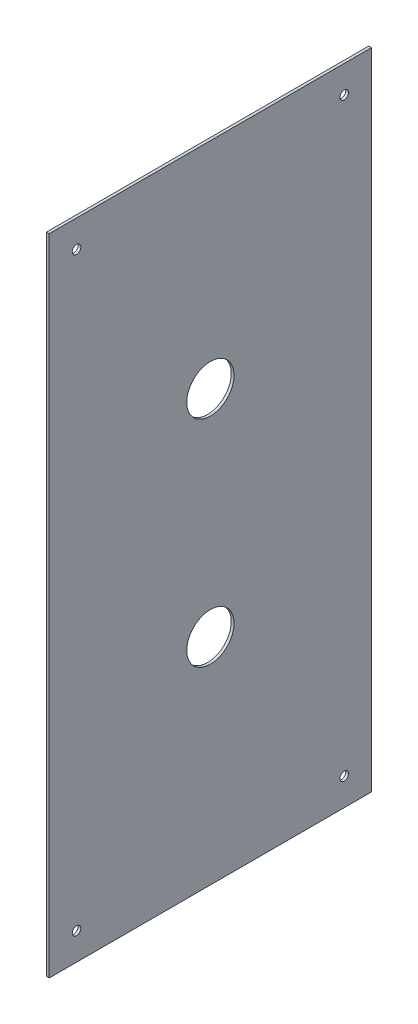
ISO-10303-21;
HEADER;
FILE_DESCRIPTION(('STEP AP214'),'2;1');
FILE_NAME('part.step','',(''),(''),'','','');
FILE_SCHEMA(('AUTOMOTIVE_DESIGN { 1 0 10303 214 1 1 1 1 }'));
ENDSEC;
DATA;
#1=APPLICATION_CONTEXT('core data for automotive mechanical design processes');
#2=APPLICATION_PROTOCOL_DEFINITION('international standard','automotive_design',2000,#1);
#3=PRODUCT_CONTEXT('',#1,'mechanical');
#4=PRODUCT('Part','Part','',(#3));
#5=PRODUCT_RELATED_PRODUCT_CATEGORY('part','',(#4));
#6=PRODUCT_DEFINITION_FORMATION('','',#4);
#7=PRODUCT_DEFINITION_CONTEXT('part definition',#1,'design');
#8=PRODUCT_DEFINITION('design','',#6,#7);
#9=PRODUCT_DEFINITION_SHAPE('','',#8);
#10=(LENGTH_UNIT() NAMED_UNIT(*) SI_UNIT(.MILLI.,.METRE.));
#11=(NAMED_UNIT(*) PLANE_ANGLE_UNIT() SI_UNIT($,.RADIAN.));
#12=(NAMED_UNIT(*) SI_UNIT($,.STERADIAN.) SOLID_ANGLE_UNIT());
#13=UNCERTAINTY_MEASURE_WITH_UNIT(LENGTH_MEASURE(1.E-05),#10,'distance_accuracy_value','');
#14=(GEOMETRIC_REPRESENTATION_CONTEXT(3) GLOBAL_UNCERTAINTY_ASSIGNED_CONTEXT((#13)) GLOBAL_UNIT_ASSIGNED_CONTEXT((#10,
#11,#12)) REPRESENTATION_CONTEXT('',''));
#15=CARTESIAN_POINT('',(0.,0.,0.));
#16=DIRECTION('',(0.,0.,1.));
#17=DIRECTION('',(1.,0.,0.));
#18=AXIS2_PLACEMENT_3D('',#15,#16,#17);
#19=CARTESIAN_POINT('',(1.3,150.,-75.));
#20=DIRECTION('',(0.,-1.,0.));
#21=DIRECTION('',(0.,0.,-1.));
#22=AXIS2_PLACEMENT_3D('',#19,#20,#21);
#23=PLANE('',#22);
#24=DIRECTION('',(0.,0.,1.));
#25=VECTOR('',#24,1.);
#26=CARTESIAN_POINT('',(0.,150.,-75.));
#27=LINE('',#26,#25);
#28=CARTESIAN_POINT('',(0.,150.,-75.));
#29=VERTEX_POINT('',#28);
#30=CARTESIAN_POINT('',(0.,150.,75.));
#31=VERTEX_POINT('',#30);
#32=EDGE_CURVE('E114',#29,#31,#27,.T.);
#33=ORIENTED_EDGE('',*,*,#32,.T.);
#34=DIRECTION('',(-1.,0.,0.));
#35=VECTOR('',#34,1.);
#36=CARTESIAN_POINT('',(1.3,150.,75.));
#37=LINE('',#36,#35);
#38=CARTESIAN_POINT('',(1.3,150.,75.));
#39=VERTEX_POINT('',#38);
#40=EDGE_CURVE('E11',#39,#31,#37,.T.);
#41=ORIENTED_EDGE('',*,*,#40,.F.);
#42=DIRECTION('',(0.,0.,1.));
#43=VECTOR('',#42,1.);
#44=CARTESIAN_POINT('',(1.3,150.,-75.));
#45=LINE('',#44,#43);
#46=CARTESIAN_POINT('',(1.3,150.,-75.));
#47=VERTEX_POINT('',#46);
#48=EDGE_CURVE('E100',#47,#39,#45,.T.);
#49=ORIENTED_EDGE('',*,*,#48,.F.);
#50=DIRECTION('',(-1.,0.,0.));
#51=VECTOR('',#50,1.);
#52=CARTESIAN_POINT('',(1.3,150.,-75.));
#53=LINE('',#52,#51);
#54=EDGE_CURVE('E108',#47,#29,#53,.T.);
#55=ORIENTED_EDGE('',*,*,#54,.T.);
#56=EDGE_LOOP('',(#33,#41,#49,#55));
#57=FACE_BOUND('',#56,.T.);
#58=ADVANCED_FACE('F44',(#57),#23,.F.);
#59=CARTESIAN_POINT('',(1.3,-150.,75.));
#60=DIRECTION('',(0.,0.,-1.));
#61=DIRECTION('',(-1.,0.,0.));
#62=AXIS2_PLACEMENT_3D('',#59,#60,#61);
#63=PLANE('',#62);
#64=DIRECTION('',(0.,-1.,0.));
#65=VECTOR('',#64,1.);
#66=CARTESIAN_POINT('',(0.,-150.,75.));
#67=LINE('',#66,#65);
#68=CARTESIAN_POINT('',(0.,-150.,75.));
#69=VERTEX_POINT('',#68);
#70=EDGE_CURVE('E105',#31,#69,#67,.T.);
#71=ORIENTED_EDGE('',*,*,#70,.T.);
#72=DIRECTION('',(-1.,0.,0.));
#73=VECTOR('',#72,1.);
#74=CARTESIAN_POINT('',(1.3,-150.,75.));
#75=LINE('',#74,#73);
#76=CARTESIAN_POINT('',(1.3,-150.,75.));
#77=VERTEX_POINT('',#76);
#78=EDGE_CURVE('E53',#77,#69,#75,.T.);
#79=ORIENTED_EDGE('',*,*,#78,.F.);
#80=DIRECTION('',(0.,-1.,0.));
#81=VECTOR('',#80,1.);
#82=CARTESIAN_POINT('',(1.3,-150.,75.));
#83=LINE('',#82,#81);
#84=EDGE_CURVE('E95',#39,#77,#83,.T.);
#85=ORIENTED_EDGE('',*,*,#84,.F.);
#86=ORIENTED_EDGE('',*,*,#40,.T.);
#87=EDGE_LOOP('',(#71,#79,#85,#86));
#88=FACE_BOUND('',#87,.T.);
#89=ADVANCED_FACE('F101',(#88),#63,.F.);
#90=CARTESIAN_POINT('',(1.3,-150.,-75.));
#91=DIRECTION('',(0.,1.,0.));
#92=DIRECTION('',(0.,0.,1.));
#93=AXIS2_PLACEMENT_3D('',#90,#91,#92);
#94=PLANE('',#93);
#95=DIRECTION('',(0.,0.,-1.));
#96=VECTOR('',#95,1.);
#97=CARTESIAN_POINT('',(0.,-150.,-75.));
#98=LINE('',#97,#96);
#99=CARTESIAN_POINT('',(0.,-150.,-75.));
#100=VERTEX_POINT('',#99);
#101=EDGE_CURVE('E76',#69,#100,#98,.T.);
#102=ORIENTED_EDGE('',*,*,#101,.T.);
#103=DIRECTION('',(-1.,0.,0.));
#104=VECTOR('',#103,1.);
#105=CARTESIAN_POINT('',(1.3,-150.,-75.));
#106=LINE('',#105,#104);
#107=CARTESIAN_POINT('',(1.3,-150.,-75.));
#108=VERTEX_POINT('',#107);
#109=EDGE_CURVE('E102',#108,#100,#106,.T.);
#110=ORIENTED_EDGE('',*,*,#109,.F.);
#111=DIRECTION('',(0.,0.,-1.));
#112=VECTOR('',#111,1.);
#113=CARTESIAN_POINT('',(1.3,-150.,-75.));
#114=LINE('',#113,#112);
#115=EDGE_CURVE('E92',#77,#108,#114,.T.);
#116=ORIENTED_EDGE('',*,*,#115,.F.);
#117=ORIENTED_EDGE('',*,*,#78,.T.);
#118=EDGE_LOOP('',(#102,#110,#116,#117));
#119=FACE_BOUND('',#118,.T.);
#120=ADVANCED_FACE('F104',(#119),#94,.F.);
#121=CARTESIAN_POINT('',(1.3,-150.,-75.));
#122=DIRECTION('',(0.,0.,1.));
#123=DIRECTION('',(1.,0.,0.));
#124=AXIS2_PLACEMENT_3D('',#121,#122,#123);
#125=PLANE('',#124);
#126=DIRECTION('',(0.,1.,0.));
#127=VECTOR('',#126,1.);
#128=CARTESIAN_POINT('',(0.,-150.,-75.));
#129=LINE('',#128,#127);
#130=EDGE_CURVE('E85',#100,#29,#129,.T.);
#131=ORIENTED_EDGE('',*,*,#130,.T.);
#132=ORIENTED_EDGE('',*,*,#54,.F.);
#133=DIRECTION('',(0.,1.,0.));
#134=VECTOR('',#133,1.);
#135=CARTESIAN_POINT('',(1.3,-150.,-75.));
#136=LINE('',#135,#134);
#137=EDGE_CURVE('E65',#108,#47,#136,.T.);
#138=ORIENTED_EDGE('',*,*,#137,.F.);
#139=ORIENTED_EDGE('',*,*,#109,.T.);
#140=EDGE_LOOP('',(#131,#132,#138,#139));
#141=FACE_BOUND('',#140,.T.);
#142=ADVANCED_FACE('F130',(#141),#125,.F.);
#143=CARTESIAN_POINT('',(1.3,0.,0.));
#144=DIRECTION('',(-1.,0.,0.));
#145=DIRECTION('',(0.,0.,1.));
#146=AXIS2_PLACEMENT_3D('',#143,#144,#145);
#147=PLANE('',#146);
#148=CARTESIAN_POINT('',(1.3,50.,0.));
#149=DIRECTION('',(1.,0.,0.));
#150=DIRECTION('',(0.,0.,-1.));
#151=AXIS2_PLACEMENT_3D('',#148,#149,#150);
#152=CIRCLE('',#151,11.);
#153=CARTESIAN_POINT('',(1.3,50.,-11.));
#154=VERTEX_POINT('',#153);
#155=EDGE_CURVE('E177',#154,#154,#152,.T.);
#156=ORIENTED_EDGE('',*,*,#155,.F.);
#157=EDGE_LOOP('',(#156));
#158=FACE_BOUND('',#157,.T.);
#159=CARTESIAN_POINT('',(1.3,-50.,0.));
#160=DIRECTION('',(1.,0.,0.));
#161=DIRECTION('',(0.,0.,-1.));
#162=AXIS2_PLACEMENT_3D('',#159,#160,#161);
#163=CIRCLE('',#162,11.);
#164=CARTESIAN_POINT('',(1.3,-50.,-11.));
#165=VERTEX_POINT('',#164);
#166=EDGE_CURVE('E166',#165,#165,#163,.T.);
#167=ORIENTED_EDGE('',*,*,#166,.F.);
#168=EDGE_LOOP('',(#167));
#169=FACE_BOUND('',#168,.T.);
#170=CARTESIAN_POINT('',(1.3,137.3,-62.3));
#171=DIRECTION('',(1.,0.,0.));
#172=DIRECTION('',(0.,0.,-1.));
#173=AXIS2_PLACEMENT_3D('',#170,#171,#172);
#174=CIRCLE('',#173,1.99999999999997);
#175=CARTESIAN_POINT('',(1.3,137.3,-64.3));
#176=VERTEX_POINT('',#175);
#177=EDGE_CURVE('E161',#176,#176,#174,.T.);
#178=ORIENTED_EDGE('',*,*,#177,.F.);
#179=EDGE_LOOP('',(#178));
#180=FACE_BOUND('',#179,.T.);
#181=CARTESIAN_POINT('',(1.3,137.3,62.3));
#182=DIRECTION('',(1.,0.,0.));
#183=DIRECTION('',(0.,0.,-1.));
#184=AXIS2_PLACEMENT_3D('',#181,#182,#183);
#185=CIRCLE('',#184,1.99999999999997);
#186=CARTESIAN_POINT('',(1.3,137.3,60.3));
#187=VERTEX_POINT('',#186);
#188=EDGE_CURVE('E153',#187,#187,#185,.T.);
#189=ORIENTED_EDGE('',*,*,#188,.F.);
#190=EDGE_LOOP('',(#189));
#191=FACE_BOUND('',#190,.T.);
#192=CARTESIAN_POINT('',(1.3,-137.3,-62.3));
#193=DIRECTION('',(1.,0.,0.));
#194=DIRECTION('',(0.,0.,-1.));
#195=AXIS2_PLACEMENT_3D('',#192,#193,#194);
#196=CIRCLE('',#195,1.99999999999997);
#197=CARTESIAN_POINT('',(1.3,-137.3,-64.3));
#198=VERTEX_POINT('',#197);
#199=EDGE_CURVE('E144',#198,#198,#196,.T.);
#200=ORIENTED_EDGE('',*,*,#199,.F.);
#201=EDGE_LOOP('',(#200));
#202=FACE_BOUND('',#201,.T.);
#203=CARTESIAN_POINT('',(1.3,-137.3,62.3));
#204=DIRECTION('',(1.,0.,0.));
#205=DIRECTION('',(0.,0.,-1.));
#206=AXIS2_PLACEMENT_3D('',#203,#204,#205);
#207=CIRCLE('',#206,1.99999999999997);
#208=CARTESIAN_POINT('',(1.3,-137.3,60.3));
#209=VERTEX_POINT('',#208);
#210=EDGE_CURVE('E137',#209,#209,#207,.T.);
#211=ORIENTED_EDGE('',*,*,#210,.F.);
#212=EDGE_LOOP('',(#211));
#213=FACE_BOUND('',#212,.T.);
#214=ORIENTED_EDGE('',*,*,#48,.T.);
#215=ORIENTED_EDGE('',*,*,#84,.T.);
#216=ORIENTED_EDGE('',*,*,#115,.T.);
#217=ORIENTED_EDGE('',*,*,#137,.T.);
#218=EDGE_LOOP('',(#214,#215,#216,#217));
#219=FACE_BOUND('',#218,.T.);
#220=ADVANCED_FACE('F91',(#158,#169,#180,#191,#202,#213,#219),#147,.F.);
#221=CARTESIAN_POINT('',(0.,0.,0.));
#222=DIRECTION('',(-1.,0.,0.));
#223=DIRECTION('',(0.,0.,1.));
#224=AXIS2_PLACEMENT_3D('',#221,#222,#223);
#225=PLANE('',#224);
#226=CARTESIAN_POINT('',(0.,50.,0.));
#227=DIRECTION('',(1.,0.,0.));
#228=DIRECTION('',(0.,0.,-1.));
#229=AXIS2_PLACEMENT_3D('',#226,#227,#228);
#230=CIRCLE('',#229,11.);
#231=CARTESIAN_POINT('',(0.,50.,-11.));
#232=VERTEX_POINT('',#231);
#233=EDGE_CURVE('E174',#232,#232,#230,.T.);
#234=ORIENTED_EDGE('',*,*,#233,.T.);
#235=EDGE_LOOP('',(#234));
#236=FACE_BOUND('',#235,.T.);
#237=CARTESIAN_POINT('',(0.,-50.,0.));
#238=DIRECTION('',(1.,0.,0.));
#239=DIRECTION('',(0.,0.,-1.));
#240=AXIS2_PLACEMENT_3D('',#237,#238,#239);
#241=CIRCLE('',#240,11.);
#242=CARTESIAN_POINT('',(0.,-50.,-11.));
#243=VERTEX_POINT('',#242);
#244=EDGE_CURVE('E164',#243,#243,#241,.T.);
#245=ORIENTED_EDGE('',*,*,#244,.T.);
#246=EDGE_LOOP('',(#245));
#247=FACE_BOUND('',#246,.T.);
#248=CARTESIAN_POINT('',(0.,137.3,-62.3));
#249=DIRECTION('',(1.,0.,0.));
#250=DIRECTION('',(0.,0.,-1.));
#251=AXIS2_PLACEMENT_3D('',#248,#249,#250);
#252=CIRCLE('',#251,2.);
#253=CARTESIAN_POINT('',(0.,137.3,-64.3));
#254=VERTEX_POINT('',#253);
#255=EDGE_CURVE('E160',#254,#254,#252,.T.);
#256=ORIENTED_EDGE('',*,*,#255,.T.);
#257=EDGE_LOOP('',(#256));
#258=FACE_BOUND('',#257,.T.);
#259=CARTESIAN_POINT('',(0.,137.3,62.3));
#260=DIRECTION('',(1.,0.,0.));
#261=DIRECTION('',(0.,0.,-1.));
#262=AXIS2_PLACEMENT_3D('',#259,#260,#261);
#263=CIRCLE('',#262,2.);
#264=CARTESIAN_POINT('',(0.,137.3,60.3));
#265=VERTEX_POINT('',#264);
#266=EDGE_CURVE('E149',#265,#265,#263,.T.);
#267=ORIENTED_EDGE('',*,*,#266,.T.);
#268=EDGE_LOOP('',(#267));
#269=FACE_BOUND('',#268,.T.);
#270=CARTESIAN_POINT('',(0.,-137.3,-62.3));
#271=DIRECTION('',(1.,0.,0.));
#272=DIRECTION('',(0.,0.,-1.));
#273=AXIS2_PLACEMENT_3D('',#270,#271,#272);
#274=CIRCLE('',#273,2.);
#275=CARTESIAN_POINT('',(0.,-137.3,-64.3));
#276=VERTEX_POINT('',#275);
#277=EDGE_CURVE('E143',#276,#276,#274,.T.);
#278=ORIENTED_EDGE('',*,*,#277,.T.);
#279=EDGE_LOOP('',(#278));
#280=FACE_BOUND('',#279,.T.);
#281=CARTESIAN_POINT('',(0.,-137.3,62.3));
#282=DIRECTION('',(1.,0.,0.));
#283=DIRECTION('',(0.,0.,-1.));
#284=AXIS2_PLACEMENT_3D('',#281,#282,#283);
#285=CIRCLE('',#284,2.);
#286=CARTESIAN_POINT('',(0.,-137.3,60.3));
#287=VERTEX_POINT('',#286);
#288=EDGE_CURVE('E120',#287,#287,#285,.T.);
#289=ORIENTED_EDGE('',*,*,#288,.T.);
#290=EDGE_LOOP('',(#289));
#291=FACE_BOUND('',#290,.T.);
#292=ORIENTED_EDGE('',*,*,#32,.F.);
#293=ORIENTED_EDGE('',*,*,#130,.F.);
#294=ORIENTED_EDGE('',*,*,#101,.F.);
#295=ORIENTED_EDGE('',*,*,#70,.F.);
#296=EDGE_LOOP('',(#292,#293,#294,#295));
#297=FACE_BOUND('',#296,.T.);
#298=ADVANCED_FACE('F128',(#236,#247,#258,#269,#280,#291,#297),#225,.T.);
#299=CARTESIAN_POINT('',(1.3,-137.3,62.3));
#300=DIRECTION('',(1.,0.,0.));
#301=DIRECTION('',(0.,0.,-1.));
#302=AXIS2_PLACEMENT_3D('',#299,#300,#301);
#303=CYLINDRICAL_SURFACE('',#302,1.99999999999999);
#304=ORIENTED_EDGE('',*,*,#288,.F.);
#305=EDGE_LOOP('',(#304));
#306=FACE_BOUND('',#305,.T.);
#307=ORIENTED_EDGE('',*,*,#210,.T.);
#308=EDGE_LOOP('',(#307));
#309=FACE_BOUND('',#308,.T.);
#310=ADVANCED_FACE('F197',(#306,#309),#303,.F.);
#311=CARTESIAN_POINT('',(1.3,-137.3,-62.3));
#312=DIRECTION('',(1.,0.,0.));
#313=DIRECTION('',(0.,0.,-1.));
#314=AXIS2_PLACEMENT_3D('',#311,#312,#313);
#315=CYLINDRICAL_SURFACE('',#314,1.99999999999999);
#316=ORIENTED_EDGE('',*,*,#277,.F.);
#317=EDGE_LOOP('',(#316));
#318=FACE_BOUND('',#317,.T.);
#319=ORIENTED_EDGE('',*,*,#199,.T.);
#320=EDGE_LOOP('',(#319));
#321=FACE_BOUND('',#320,.T.);
#322=ADVANCED_FACE('F200',(#318,#321),#315,.F.);
#323=CARTESIAN_POINT('',(1.3,137.3,62.3));
#324=DIRECTION('',(1.,0.,0.));
#325=DIRECTION('',(0.,0.,-1.));
#326=AXIS2_PLACEMENT_3D('',#323,#324,#325);
#327=CYLINDRICAL_SURFACE('',#326,1.99999999999999);
#328=ORIENTED_EDGE('',*,*,#266,.F.);
#329=EDGE_LOOP('',(#328));
#330=FACE_BOUND('',#329,.T.);
#331=ORIENTED_EDGE('',*,*,#188,.T.);
#332=EDGE_LOOP('',(#331));
#333=FACE_BOUND('',#332,.T.);
#334=ADVANCED_FACE('F206',(#330,#333),#327,.F.);
#335=CARTESIAN_POINT('',(1.3,137.3,-62.3));
#336=DIRECTION('',(1.,0.,0.));
#337=DIRECTION('',(0.,0.,-1.));
#338=AXIS2_PLACEMENT_3D('',#335,#336,#337);
#339=CYLINDRICAL_SURFACE('',#338,1.99999999999999);
#340=ORIENTED_EDGE('',*,*,#255,.F.);
#341=EDGE_LOOP('',(#340));
#342=FACE_BOUND('',#341,.T.);
#343=ORIENTED_EDGE('',*,*,#177,.T.);
#344=EDGE_LOOP('',(#343));
#345=FACE_BOUND('',#344,.T.);
#346=ADVANCED_FACE('F266',(#342,#345),#339,.F.);
#347=CARTESIAN_POINT('',(1.3,-50.,0.));
#348=DIRECTION('',(1.,0.,0.));
#349=DIRECTION('',(0.,0.,-1.));
#350=AXIS2_PLACEMENT_3D('',#347,#348,#349);
#351=CYLINDRICAL_SURFACE('',#350,11.);
#352=ORIENTED_EDGE('',*,*,#244,.F.);
#353=EDGE_LOOP('',(#352));
#354=FACE_BOUND('',#353,.T.);
#355=ORIENTED_EDGE('',*,*,#166,.T.);
#356=EDGE_LOOP('',(#355));
#357=FACE_BOUND('',#356,.T.);
#358=ADVANCED_FACE('F274',(#354,#357),#351,.F.);
#359=CARTESIAN_POINT('',(1.3,50.,0.));
#360=DIRECTION('',(1.,0.,0.));
#361=DIRECTION('',(0.,0.,-1.));
#362=AXIS2_PLACEMENT_3D('',#359,#360,#361);
#363=CYLINDRICAL_SURFACE('',#362,11.);
#364=ORIENTED_EDGE('',*,*,#233,.F.);
#365=EDGE_LOOP('',(#364));
#366=FACE_BOUND('',#365,.T.);
#367=ORIENTED_EDGE('',*,*,#155,.T.);
#368=EDGE_LOOP('',(#367));
#369=FACE_BOUND('',#368,.T.);
#370=ADVANCED_FACE('F185',(#366,#369),#363,.F.);
#371=CLOSED_SHELL('',(#58,#89,#120,#142,#220,#298,#310,#322,#334,#346,#358,#370));
#372=MANIFOLD_SOLID_BREP('B2',#371);
#373=ADVANCED_BREP_SHAPE_REPRESENTATION('',(#18,#372),#14);
#374=SHAPE_DEFINITION_REPRESENTATION(#9,#373);
ENDSEC;
END-ISO-10303-21;
